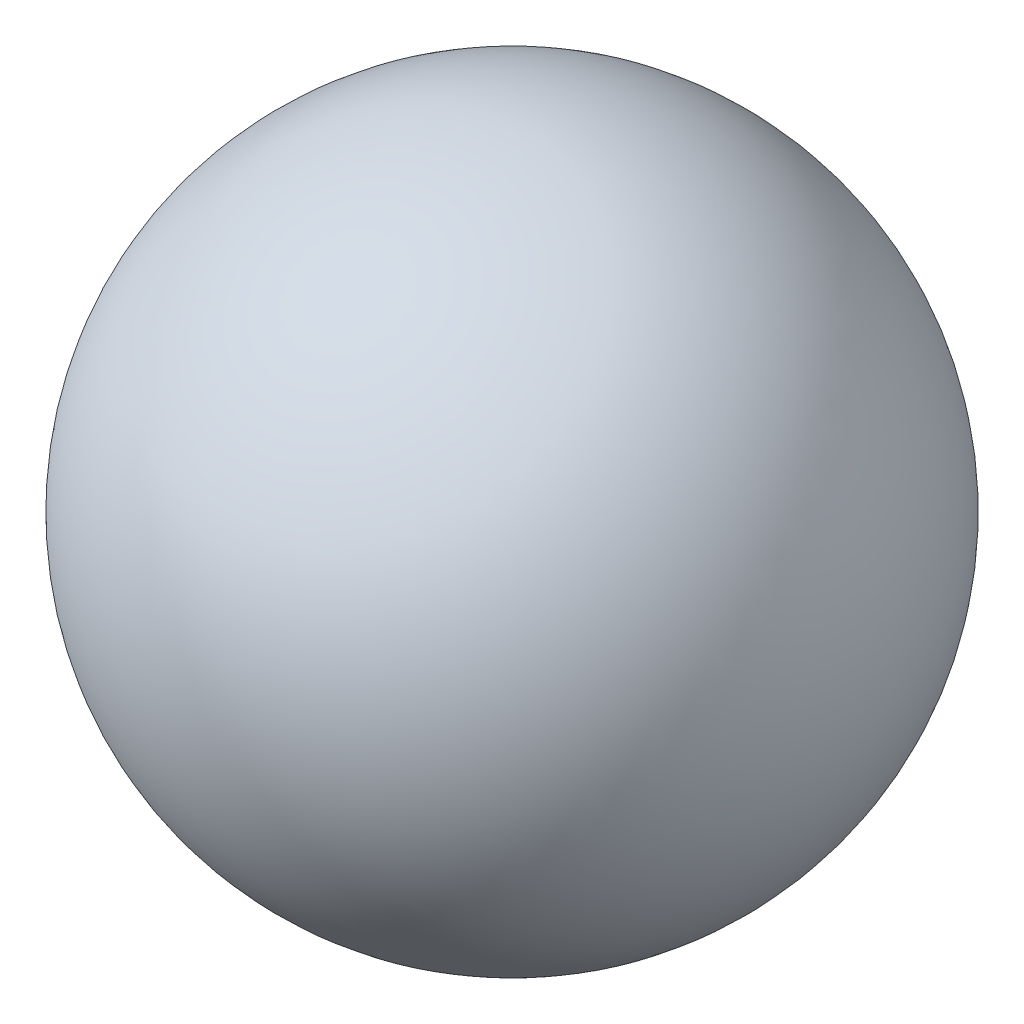
ISO-10303-21;
HEADER;
FILE_DESCRIPTION(('STEP AP214'),'2;1');
FILE_NAME('part.step','',(''),(''),'','','');
FILE_SCHEMA(('AUTOMOTIVE_DESIGN { 1 0 10303 214 1 1 1 1 }'));
ENDSEC;
DATA;
#1=APPLICATION_CONTEXT('core data for automotive mechanical design processes');
#2=APPLICATION_PROTOCOL_DEFINITION('international standard','automotive_design',2000,#1);
#3=PRODUCT_CONTEXT('',#1,'mechanical');
#4=PRODUCT('Part','Part','',(#3));
#5=PRODUCT_RELATED_PRODUCT_CATEGORY('part','',(#4));
#6=PRODUCT_DEFINITION_FORMATION('','',#4);
#7=PRODUCT_DEFINITION_CONTEXT('part definition',#1,'design');
#8=PRODUCT_DEFINITION('design','',#6,#7);
#9=PRODUCT_DEFINITION_SHAPE('','',#8);
#10=(LENGTH_UNIT() NAMED_UNIT(*) SI_UNIT(.MILLI.,.METRE.));
#11=(NAMED_UNIT(*) PLANE_ANGLE_UNIT() SI_UNIT($,.RADIAN.));
#12=(NAMED_UNIT(*) SI_UNIT($,.STERADIAN.) SOLID_ANGLE_UNIT());
#13=UNCERTAINTY_MEASURE_WITH_UNIT(LENGTH_MEASURE(1.E-05),#10,'distance_accuracy_value','');
#14=(GEOMETRIC_REPRESENTATION_CONTEXT(3) GLOBAL_UNCERTAINTY_ASSIGNED_CONTEXT((#13)) GLOBAL_UNIT_ASSIGNED_CONTEXT((#10,
#11,#12)) REPRESENTATION_CONTEXT('',''));
#15=CARTESIAN_POINT('',(0.,0.,0.));
#16=DIRECTION('',(0.,0.,1.));
#17=DIRECTION('',(1.,0.,0.));
#18=AXIS2_PLACEMENT_3D('',#15,#16,#17);
#19=CARTESIAN_POINT('',(0.,0.,0.));
#20=DIRECTION('',(0.,1.,0.));
#21=DIRECTION('',(1.,0.,0.));
#22=AXIS2_PLACEMENT_3D('',#19,#20,#21);
#23=SPHERICAL_SURFACE('',#22,6.35);
#24=CARTESIAN_POINT('',(0.,6.35,0.));
#25=VERTEX_POINT('',#24);
#26=VERTEX_LOOP('',#25);
#27=FACE_BOUND('',#26,.T.);
#28=ADVANCED_FACE('F33',(#27),#23,.T.);
#29=CLOSED_SHELL('',(#28));
#30=MANIFOLD_SOLID_BREP('B2',#29);
#31=ADVANCED_BREP_SHAPE_REPRESENTATION('',(#18,#30),#14);
#32=SHAPE_DEFINITION_REPRESENTATION(#9,#31);
ENDSEC;
END-ISO-10303-21;
